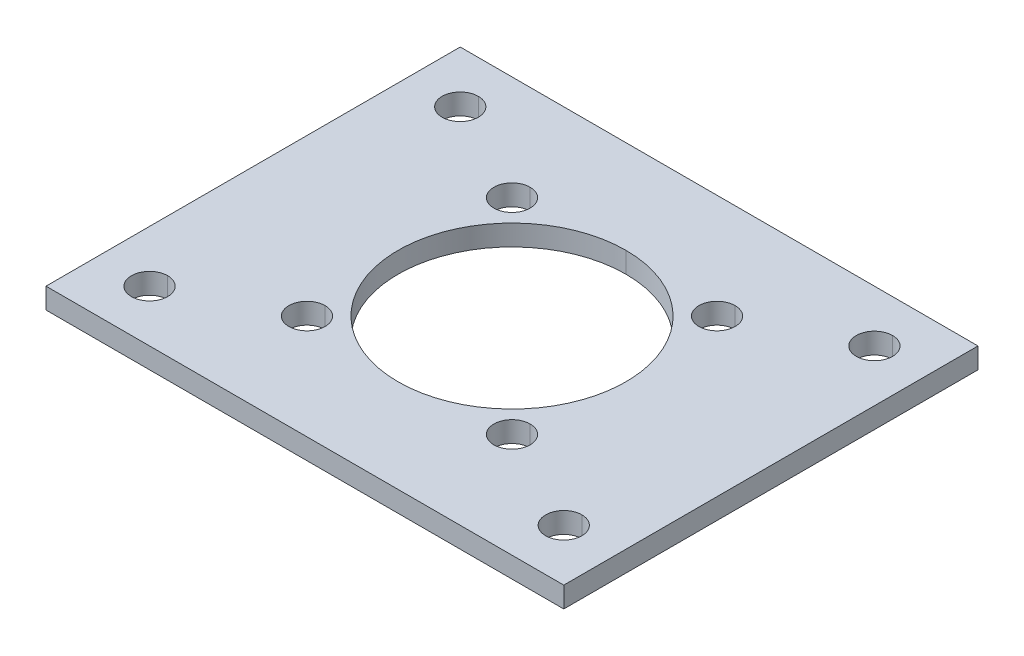
ISO-10303-21;
HEADER;
FILE_DESCRIPTION(('STEP AP214'),'2;1');
FILE_NAME('part.step','',(''),(''),'','','');
FILE_SCHEMA(('AUTOMOTIVE_DESIGN { 1 0 10303 214 1 1 1 1 }'));
ENDSEC;
DATA;
#1=APPLICATION_CONTEXT('core data for automotive mechanical design processes');
#2=APPLICATION_PROTOCOL_DEFINITION('international standard','automotive_design',2000,#1);
#3=PRODUCT_CONTEXT('',#1,'mechanical');
#4=PRODUCT('Part','Part','',(#3));
#5=PRODUCT_RELATED_PRODUCT_CATEGORY('part','',(#4));
#6=PRODUCT_DEFINITION_FORMATION('','',#4);
#7=PRODUCT_DEFINITION_CONTEXT('part definition',#1,'design');
#8=PRODUCT_DEFINITION('design','',#6,#7);
#9=PRODUCT_DEFINITION_SHAPE('','',#8);
#10=(LENGTH_UNIT() NAMED_UNIT(*) SI_UNIT(.MILLI.,.METRE.));
#11=(NAMED_UNIT(*) PLANE_ANGLE_UNIT() SI_UNIT($,.RADIAN.));
#12=(NAMED_UNIT(*) SI_UNIT($,.STERADIAN.) SOLID_ANGLE_UNIT());
#13=UNCERTAINTY_MEASURE_WITH_UNIT(LENGTH_MEASURE(1.E-05),#10,'distance_accuracy_value','');
#14=(GEOMETRIC_REPRESENTATION_CONTEXT(3) GLOBAL_UNCERTAINTY_ASSIGNED_CONTEXT((#13)) GLOBAL_UNIT_ASSIGNED_CONTEXT((#10,
#11,#12)) REPRESENTATION_CONTEXT('',''));
#15=CARTESIAN_POINT('',(0.,0.,0.));
#16=DIRECTION('',(0.,0.,1.));
#17=DIRECTION('',(1.,0.,0.));
#18=AXIS2_PLACEMENT_3D('',#15,#16,#17);
#19=CARTESIAN_POINT('',(-9.89949493661162,2.,-9.89949493661117));
#20=DIRECTION('',(0.,-1.,0.));
#21=DIRECTION('',(0.,0.,-1.));
#22=AXIS2_PLACEMENT_3D('',#19,#20,#21);
#23=CYLINDRICAL_SURFACE('',#22,1.7500000000006);
#24=DIRECTION('',(0.,-1.,0.));
#25=VECTOR('',#24,1.);
#26=CARTESIAN_POINT('',(-9.89949493661162,2.,-8.14949493661057));
#27=LINE('',#26,#25);
#28=CARTESIAN_POINT('',(-9.89949493661162,2.,-8.14949493661057));
#29=VERTEX_POINT('',#28);
#30=CARTESIAN_POINT('',(-9.89949493661162,0.,-8.14949493661057));
#31=VERTEX_POINT('',#30);
#32=EDGE_CURVE('E291',#29,#31,#27,.T.);
#33=ORIENTED_EDGE('',*,*,#32,.F.);
#34=CARTESIAN_POINT('',(-9.89949493661162,2.,-9.89949493661117));
#35=DIRECTION('',(0.,1.,0.));
#36=DIRECTION('',(0.,0.,1.));
#37=AXIS2_PLACEMENT_3D('',#34,#35,#36);
#38=CIRCLE('',#37,1.7500000000006);
#39=CARTESIAN_POINT('',(-9.89949493661162,2.,-11.6494949366118));
#40=VERTEX_POINT('',#39);
#41=EDGE_CURVE('E567',#29,#40,#38,.T.);
#42=ORIENTED_EDGE('',*,*,#41,.T.);
#43=DIRECTION('',(0.,-1.,0.));
#44=VECTOR('',#43,1.);
#45=CARTESIAN_POINT('',(-9.89949493661162,2.,-11.6494949366118));
#46=LINE('',#45,#44);
#47=CARTESIAN_POINT('',(-9.89949493661162,0.,-11.6494949366118));
#48=VERTEX_POINT('',#47);
#49=EDGE_CURVE('E456',#40,#48,#46,.T.);
#50=ORIENTED_EDGE('',*,*,#49,.T.);
#51=CARTESIAN_POINT('',(-9.89949493661162,0.,-9.89949493661117));
#52=DIRECTION('',(0.,1.,0.));
#53=DIRECTION('',(0.,0.,1.));
#54=AXIS2_PLACEMENT_3D('',#51,#52,#53);
#55=CIRCLE('',#54,1.7500000000006);
#56=EDGE_CURVE('E301',#31,#48,#55,.T.);
#57=ORIENTED_EDGE('',*,*,#56,.F.);
#58=EDGE_LOOP('',(#33,#42,#50,#57));
#59=FACE_BOUND('',#58,.T.);
#60=ADVANCED_FACE('F16',(#59),#23,.F.);
#61=CARTESIAN_POINT('',(-9.89949493661117,2.,9.89949493661216));
#62=DIRECTION('',(0.,-1.,0.));
#63=DIRECTION('',(0.,0.,-1.));
#64=AXIS2_PLACEMENT_3D('',#61,#62,#63);
#65=CYLINDRICAL_SURFACE('',#64,1.75000000000041);
#66=DIRECTION('',(0.,-1.,0.));
#67=VECTOR('',#66,1.);
#68=CARTESIAN_POINT('',(-9.89949493661117,2.,11.6494949366126));
#69=LINE('',#68,#67);
#70=CARTESIAN_POINT('',(-9.89949493661117,2.,11.6494949366126));
#71=VERTEX_POINT('',#70);
#72=CARTESIAN_POINT('',(-9.89949493661117,0.,11.6494949366126));
#73=VERTEX_POINT('',#72);
#74=EDGE_CURVE('E367',#71,#73,#69,.T.);
#75=ORIENTED_EDGE('',*,*,#74,.F.);
#76=CARTESIAN_POINT('',(-9.89949493661117,2.,9.89949493661216));
#77=DIRECTION('',(0.,1.,0.));
#78=DIRECTION('',(0.,0.,1.));
#79=AXIS2_PLACEMENT_3D('',#76,#77,#78);
#80=CIRCLE('',#79,1.75000000000041);
#81=CARTESIAN_POINT('',(-9.89949493661117,2.,8.14949493661176));
#82=VERTEX_POINT('',#81);
#83=EDGE_CURVE('E278',#71,#82,#80,.T.);
#84=ORIENTED_EDGE('',*,*,#83,.T.);
#85=DIRECTION('',(0.,-1.,0.));
#86=VECTOR('',#85,1.);
#87=CARTESIAN_POINT('',(-9.89949493661117,2.,8.14949493661176));
#88=LINE('',#87,#86);
#89=CARTESIAN_POINT('',(-9.89949493661117,0.,8.14949493661176));
#90=VERTEX_POINT('',#89);
#91=EDGE_CURVE('E379',#82,#90,#88,.T.);
#92=ORIENTED_EDGE('',*,*,#91,.T.);
#93=CARTESIAN_POINT('',(-9.89949493661117,0.,9.89949493661216));
#94=DIRECTION('',(0.,1.,0.));
#95=DIRECTION('',(0.,0.,1.));
#96=AXIS2_PLACEMENT_3D('',#93,#94,#95);
#97=CIRCLE('',#96,1.75000000000041);
#98=EDGE_CURVE('E499',#73,#90,#97,.T.);
#99=ORIENTED_EDGE('',*,*,#98,.F.);
#100=EDGE_LOOP('',(#75,#84,#92,#99));
#101=FACE_BOUND('',#100,.T.);
#102=ADVANCED_FACE('F589',(#101),#65,.F.);
#103=CARTESIAN_POINT('',(9.89949493661216,2.,9.89949493661172));
#104=DIRECTION('',(0.,-1.,0.));
#105=DIRECTION('',(0.,0.,-1.));
#106=AXIS2_PLACEMENT_3D('',#103,#104,#105);
#107=CYLINDRICAL_SURFACE('',#106,1.74999999999986);
#108=DIRECTION('',(0.,-1.,0.));
#109=VECTOR('',#108,1.);
#110=CARTESIAN_POINT('',(9.89949493661216,2.,11.6494949366116));
#111=LINE('',#110,#109);
#112=CARTESIAN_POINT('',(9.89949493661216,2.,11.6494949366116));
#113=VERTEX_POINT('',#112);
#114=CARTESIAN_POINT('',(9.89949493661216,0.,11.6494949366116));
#115=VERTEX_POINT('',#114);
#116=EDGE_CURVE('E404',#113,#115,#111,.T.);
#117=ORIENTED_EDGE('',*,*,#116,.F.);
#118=CARTESIAN_POINT('',(9.89949493661216,2.,9.89949493661172));
#119=DIRECTION('',(0.,1.,0.));
#120=DIRECTION('',(0.,0.,1.));
#121=AXIS2_PLACEMENT_3D('',#118,#119,#120);
#122=CIRCLE('',#121,1.74999999999986);
#123=CARTESIAN_POINT('',(9.89949493661216,2.,8.14949493661186));
#124=VERTEX_POINT('',#123);
#125=EDGE_CURVE('E275',#113,#124,#122,.T.);
#126=ORIENTED_EDGE('',*,*,#125,.T.);
#127=DIRECTION('',(0.,-1.,0.));
#128=VECTOR('',#127,1.);
#129=CARTESIAN_POINT('',(9.89949493661216,2.,8.14949493661186));
#130=LINE('',#129,#128);
#131=CARTESIAN_POINT('',(9.89949493661216,0.,8.14949493661186));
#132=VERTEX_POINT('',#131);
#133=EDGE_CURVE('E387',#124,#132,#130,.T.);
#134=ORIENTED_EDGE('',*,*,#133,.T.);
#135=CARTESIAN_POINT('',(9.89949493661216,0.,9.89949493661172));
#136=DIRECTION('',(0.,1.,0.));
#137=DIRECTION('',(0.,0.,1.));
#138=AXIS2_PLACEMENT_3D('',#135,#136,#137);
#139=CIRCLE('',#138,1.74999999999986);
#140=EDGE_CURVE('E252',#115,#132,#139,.T.);
#141=ORIENTED_EDGE('',*,*,#140,.F.);
#142=EDGE_LOOP('',(#117,#126,#134,#141));
#143=FACE_BOUND('',#142,.T.);
#144=ADVANCED_FACE('F1100',(#143),#107,.F.);
#145=CARTESIAN_POINT('',(-20.,2.,15.));
#146=DIRECTION('',(0.,-1.,0.));
#147=DIRECTION('',(0.,0.,-1.));
#148=AXIS2_PLACEMENT_3D('',#145,#146,#147);
#149=CYLINDRICAL_SURFACE('',#148,1.75);
#150=DIRECTION('',(0.,-1.,0.));
#151=VECTOR('',#150,1.);
#152=CARTESIAN_POINT('',(-20.,2.,16.75));
#153=LINE('',#152,#151);
#154=CARTESIAN_POINT('',(-20.,2.,16.75));
#155=VERTEX_POINT('',#154);
#156=CARTESIAN_POINT('',(-20.,0.,16.75));
#157=VERTEX_POINT('',#156);
#158=EDGE_CURVE('E320',#155,#157,#153,.T.);
#159=ORIENTED_EDGE('',*,*,#158,.F.);
#160=CARTESIAN_POINT('',(-20.,2.,15.));
#161=DIRECTION('',(0.,1.,0.));
#162=DIRECTION('',(0.,0.,1.));
#163=AXIS2_PLACEMENT_3D('',#160,#161,#162);
#164=CIRCLE('',#163,1.75);
#165=CARTESIAN_POINT('',(-20.,2.,13.25));
#166=VERTEX_POINT('',#165);
#167=EDGE_CURVE('E279',#155,#166,#164,.T.);
#168=ORIENTED_EDGE('',*,*,#167,.T.);
#169=DIRECTION('',(0.,-1.,0.));
#170=VECTOR('',#169,1.);
#171=CARTESIAN_POINT('',(-20.,2.,13.25));
#172=LINE('',#171,#170);
#173=CARTESIAN_POINT('',(-20.,0.,13.25));
#174=VERTEX_POINT('',#173);
#175=EDGE_CURVE('E436',#166,#174,#172,.T.);
#176=ORIENTED_EDGE('',*,*,#175,.T.);
#177=CARTESIAN_POINT('',(-20.,0.,15.));
#178=DIRECTION('',(0.,1.,0.));
#179=DIRECTION('',(0.,0.,1.));
#180=AXIS2_PLACEMENT_3D('',#177,#178,#179);
#181=CIRCLE('',#180,1.75);
#182=EDGE_CURVE('E20',#157,#174,#181,.T.);
#183=ORIENTED_EDGE('',*,*,#182,.F.);
#184=EDGE_LOOP('',(#159,#168,#176,#183));
#185=FACE_BOUND('',#184,.T.);
#186=ADVANCED_FACE('F1016',(#185),#149,.F.);
#187=CARTESIAN_POINT('',(-20.,2.,-15.));
#188=DIRECTION('',(0.,-1.,0.));
#189=DIRECTION('',(0.,0.,-1.));
#190=AXIS2_PLACEMENT_3D('',#187,#188,#189);
#191=CYLINDRICAL_SURFACE('',#190,1.75);
#192=DIRECTION('',(0.,-1.,0.));
#193=VECTOR('',#192,1.);
#194=CARTESIAN_POINT('',(-20.,2.,-13.25));
#195=LINE('',#194,#193);
#196=CARTESIAN_POINT('',(-20.,2.,-13.25));
#197=VERTEX_POINT('',#196);
#198=CARTESIAN_POINT('',(-20.,0.,-13.25));
#199=VERTEX_POINT('',#198);
#200=EDGE_CURVE('E312',#197,#199,#195,.T.);
#201=ORIENTED_EDGE('',*,*,#200,.F.);
#202=CARTESIAN_POINT('',(-20.,2.,-15.));
#203=DIRECTION('',(0.,1.,0.));
#204=DIRECTION('',(0.,0.,1.));
#205=AXIS2_PLACEMENT_3D('',#202,#203,#204);
#206=CIRCLE('',#205,1.75);
#207=CARTESIAN_POINT('',(-20.,2.,-16.75));
#208=VERTEX_POINT('',#207);
#209=EDGE_CURVE('E462',#197,#208,#206,.T.);
#210=ORIENTED_EDGE('',*,*,#209,.T.);
#211=DIRECTION('',(0.,-1.,0.));
#212=VECTOR('',#211,1.);
#213=CARTESIAN_POINT('',(-20.,2.,-16.75));
#214=LINE('',#213,#212);
#215=CARTESIAN_POINT('',(-20.,0.,-16.75));
#216=VERTEX_POINT('',#215);
#217=EDGE_CURVE('E515',#208,#216,#214,.T.);
#218=ORIENTED_EDGE('',*,*,#217,.T.);
#219=CARTESIAN_POINT('',(-20.,0.,-15.));
#220=DIRECTION('',(0.,1.,0.));
#221=DIRECTION('',(0.,0.,1.));
#222=AXIS2_PLACEMENT_3D('',#219,#220,#221);
#223=CIRCLE('',#222,1.75);
#224=EDGE_CURVE('E516',#199,#216,#223,.T.);
#225=ORIENTED_EDGE('',*,*,#224,.F.);
#226=EDGE_LOOP('',(#201,#210,#218,#225));
#227=FACE_BOUND('',#226,.T.);
#228=ADVANCED_FACE('F1012',(#227),#191,.F.);
#229=CARTESIAN_POINT('',(9.89949493661172,2.,-9.89949493661161));
#230=DIRECTION('',(0.,-1.,0.));
#231=DIRECTION('',(0.,0.,-1.));
#232=AXIS2_PLACEMENT_3D('',#229,#230,#231);
#233=CYLINDRICAL_SURFACE('',#232,1.75);
#234=DIRECTION('',(0.,-1.,0.));
#235=VECTOR('',#234,1.);
#236=CARTESIAN_POINT('',(9.89949493661172,2.,-8.14949493661162));
#237=LINE('',#236,#235);
#238=CARTESIAN_POINT('',(9.89949493661172,2.,-8.14949493661161));
#239=VERTEX_POINT('',#238);
#240=CARTESIAN_POINT('',(9.89949493661172,0.,-8.14949493661161));
#241=VERTEX_POINT('',#240);
#242=EDGE_CURVE('E497',#239,#241,#237,.T.);
#243=ORIENTED_EDGE('',*,*,#242,.F.);
#244=CARTESIAN_POINT('',(9.89949493661172,2.,-9.89949493661161));
#245=DIRECTION('',(0.,1.,0.));
#246=DIRECTION('',(0.,0.,1.));
#247=AXIS2_PLACEMENT_3D('',#244,#245,#246);
#248=CIRCLE('',#247,1.75);
#249=CARTESIAN_POINT('',(9.89949493661172,2.,-11.6494949366116));
#250=VERTEX_POINT('',#249);
#251=EDGE_CURVE('E459',#239,#250,#248,.T.);
#252=ORIENTED_EDGE('',*,*,#251,.T.);
#253=DIRECTION('',(0.,-1.,0.));
#254=VECTOR('',#253,1.);
#255=CARTESIAN_POINT('',(9.89949493661172,2.,-11.6494949366116));
#256=LINE('',#255,#254);
#257=CARTESIAN_POINT('',(9.89949493661172,0.,-11.6494949366116));
#258=VERTEX_POINT('',#257);
#259=EDGE_CURVE('E467',#250,#258,#256,.T.);
#260=ORIENTED_EDGE('',*,*,#259,.T.);
#261=CARTESIAN_POINT('',(9.89949493661172,0.,-9.89949493661161));
#262=DIRECTION('',(0.,1.,0.));
#263=DIRECTION('',(0.,0.,1.));
#264=AXIS2_PLACEMENT_3D('',#261,#262,#263);
#265=CIRCLE('',#264,1.75);
#266=EDGE_CURVE('E620',#241,#258,#265,.T.);
#267=ORIENTED_EDGE('',*,*,#266,.F.);
#268=EDGE_LOOP('',(#243,#252,#260,#267));
#269=FACE_BOUND('',#268,.T.);
#270=ADVANCED_FACE('F815',(#269),#233,.F.);
#271=CARTESIAN_POINT('',(20.,2.,15.));
#272=DIRECTION('',(0.,-1.,0.));
#273=DIRECTION('',(0.,0.,-1.));
#274=AXIS2_PLACEMENT_3D('',#271,#272,#273);
#275=CYLINDRICAL_SURFACE('',#274,1.75);
#276=DIRECTION('',(0.,-1.,0.));
#277=VECTOR('',#276,1.);
#278=CARTESIAN_POINT('',(20.,2.,16.75));
#279=LINE('',#278,#277);
#280=CARTESIAN_POINT('',(20.,2.,16.75));
#281=VERTEX_POINT('',#280);
#282=CARTESIAN_POINT('',(20.,0.,16.75));
#283=VERTEX_POINT('',#282);
#284=EDGE_CURVE('E345',#281,#283,#279,.T.);
#285=ORIENTED_EDGE('',*,*,#284,.F.);
#286=CARTESIAN_POINT('',(20.,2.,15.));
#287=DIRECTION('',(0.,1.,0.));
#288=DIRECTION('',(0.,0.,1.));
#289=AXIS2_PLACEMENT_3D('',#286,#287,#288);
#290=CIRCLE('',#289,1.75);
#291=CARTESIAN_POINT('',(20.,2.,13.25));
#292=VERTEX_POINT('',#291);
#293=EDGE_CURVE('E223',#281,#292,#290,.T.);
#294=ORIENTED_EDGE('',*,*,#293,.T.);
#295=DIRECTION('',(0.,-1.,0.));
#296=VECTOR('',#295,1.);
#297=CARTESIAN_POINT('',(20.,2.,13.25));
#298=LINE('',#297,#296);
#299=CARTESIAN_POINT('',(20.,0.,13.25));
#300=VERTEX_POINT('',#299);
#301=EDGE_CURVE('E237',#292,#300,#298,.T.);
#302=ORIENTED_EDGE('',*,*,#301,.T.);
#303=CARTESIAN_POINT('',(20.,0.,15.));
#304=DIRECTION('',(0.,1.,0.));
#305=DIRECTION('',(0.,0.,1.));
#306=AXIS2_PLACEMENT_3D('',#303,#304,#305);
#307=CIRCLE('',#306,1.75);
#308=EDGE_CURVE('E268',#283,#300,#307,.T.);
#309=ORIENTED_EDGE('',*,*,#308,.F.);
#310=EDGE_LOOP('',(#285,#294,#302,#309));
#311=FACE_BOUND('',#310,.T.);
#312=ADVANCED_FACE('F537',(#311),#275,.F.);
#313=CARTESIAN_POINT('',(20.,2.,-15.));
#314=DIRECTION('',(0.,-1.,0.));
#315=DIRECTION('',(0.,0.,-1.));
#316=AXIS2_PLACEMENT_3D('',#313,#314,#315);
#317=CYLINDRICAL_SURFACE('',#316,1.75);
#318=DIRECTION('',(0.,-1.,0.));
#319=VECTOR('',#318,1.);
#320=CARTESIAN_POINT('',(20.,2.,-13.25));
#321=LINE('',#320,#319);
#322=CARTESIAN_POINT('',(20.,2.,-13.25));
#323=VERTEX_POINT('',#322);
#324=CARTESIAN_POINT('',(20.,0.,-13.25));
#325=VERTEX_POINT('',#324);
#326=EDGE_CURVE('E218',#323,#325,#321,.T.);
#327=ORIENTED_EDGE('',*,*,#326,.F.);
#328=CARTESIAN_POINT('',(20.,2.,-15.));
#329=DIRECTION('',(0.,1.,0.));
#330=DIRECTION('',(0.,0.,1.));
#331=AXIS2_PLACEMENT_3D('',#328,#329,#330);
#332=CIRCLE('',#331,1.75);
#333=CARTESIAN_POINT('',(20.,2.,-16.75));
#334=VERTEX_POINT('',#333);
#335=EDGE_CURVE('E212',#323,#334,#332,.T.);
#336=ORIENTED_EDGE('',*,*,#335,.T.);
#337=DIRECTION('',(0.,-1.,0.));
#338=VECTOR('',#337,1.);
#339=CARTESIAN_POINT('',(20.,2.,-16.75));
#340=LINE('',#339,#338);
#341=CARTESIAN_POINT('',(20.,0.,-16.75));
#342=VERTEX_POINT('',#341);
#343=EDGE_CURVE('E215',#334,#342,#340,.T.);
#344=ORIENTED_EDGE('',*,*,#343,.T.);
#345=CARTESIAN_POINT('',(20.,0.,-15.));
#346=DIRECTION('',(0.,1.,0.));
#347=DIRECTION('',(0.,0.,1.));
#348=AXIS2_PLACEMENT_3D('',#345,#346,#347);
#349=CIRCLE('',#348,1.75);
#350=EDGE_CURVE('E344',#325,#342,#349,.T.);
#351=ORIENTED_EDGE('',*,*,#350,.F.);
#352=EDGE_LOOP('',(#327,#336,#344,#351));
#353=FACE_BOUND('',#352,.T.);
#354=ADVANCED_FACE('F214',(#353),#317,.F.);
#355=CARTESIAN_POINT('',(0.,2.,0.));
#356=DIRECTION('',(0.,-1.,0.));
#357=DIRECTION('',(0.,0.,-1.));
#358=AXIS2_PLACEMENT_3D('',#355,#356,#357);
#359=CYLINDRICAL_SURFACE('',#358,11.);
#360=DIRECTION('',(0.,-1.,0.));
#361=VECTOR('',#360,1.);
#362=CARTESIAN_POINT('',(0.,2.,11.));
#363=LINE('',#362,#361);
#364=CARTESIAN_POINT('',(0.,2.,11.));
#365=VERTEX_POINT('',#364);
#366=CARTESIAN_POINT('',(0.,0.,11.));
#367=VERTEX_POINT('',#366);
#368=EDGE_CURVE('E438',#365,#367,#363,.T.);
#369=ORIENTED_EDGE('',*,*,#368,.F.);
#370=CARTESIAN_POINT('',(0.,2.,0.));
#371=DIRECTION('',(0.,1.,0.));
#372=DIRECTION('',(0.,0.,1.));
#373=AXIS2_PLACEMENT_3D('',#370,#371,#372);
#374=CIRCLE('',#373,11.);
#375=CARTESIAN_POINT('',(0.,2.,-11.));
#376=VERTEX_POINT('',#375);
#377=EDGE_CURVE('E224',#365,#376,#374,.T.);
#378=ORIENTED_EDGE('',*,*,#377,.T.);
#379=DIRECTION('',(0.,-1.,0.));
#380=VECTOR('',#379,1.);
#381=CARTESIAN_POINT('',(0.,2.,-11.));
#382=LINE('',#381,#380);
#383=CARTESIAN_POINT('',(0.,0.,-11.));
#384=VERTEX_POINT('',#383);
#385=EDGE_CURVE('E323',#376,#384,#382,.T.);
#386=ORIENTED_EDGE('',*,*,#385,.T.);
#387=CARTESIAN_POINT('',(0.,0.,0.));
#388=DIRECTION('',(0.,1.,0.));
#389=DIRECTION('',(0.,0.,1.));
#390=AXIS2_PLACEMENT_3D('',#387,#388,#389);
#391=CIRCLE('',#390,11.);
#392=EDGE_CURVE('E339',#367,#384,#391,.T.);
#393=ORIENTED_EDGE('',*,*,#392,.F.);
#394=EDGE_LOOP('',(#369,#378,#386,#393));
#395=FACE_BOUND('',#394,.T.);
#396=ADVANCED_FACE('F831',(#395),#359,.F.);
#397=CARTESIAN_POINT('',(25.,2.,-20.));
#398=DIRECTION('',(0.,0.,1.));
#399=DIRECTION('',(1.,0.,0.));
#400=AXIS2_PLACEMENT_3D('',#397,#398,#399);
#401=PLANE('',#400);
#402=DIRECTION('',(-1.,0.,0.));
#403=VECTOR('',#402,1.);
#404=CARTESIAN_POINT('',(25.,0.,-20.));
#405=LINE('',#404,#403);
#406=CARTESIAN_POINT('',(25.,0.,-20.));
#407=VERTEX_POINT('',#406);
#408=CARTESIAN_POINT('',(-25.,0.,-20.));
#409=VERTEX_POINT('',#408);
#410=EDGE_CURVE('E374',#407,#409,#405,.T.);
#411=ORIENTED_EDGE('',*,*,#410,.T.);
#412=DIRECTION('',(0.,-1.,0.));
#413=VECTOR('',#412,1.);
#414=CARTESIAN_POINT('',(-25.,2.,-20.));
#415=LINE('',#414,#413);
#416=CARTESIAN_POINT('',(-25.,2.,-20.));
#417=VERTEX_POINT('',#416);
#418=EDGE_CURVE('E271',#417,#409,#415,.T.);
#419=ORIENTED_EDGE('',*,*,#418,.F.);
#420=DIRECTION('',(-1.,0.,0.));
#421=VECTOR('',#420,1.);
#422=CARTESIAN_POINT('',(25.,2.,-20.));
#423=LINE('',#422,#421);
#424=CARTESIAN_POINT('',(25.,2.,-20.));
#425=VERTEX_POINT('',#424);
#426=EDGE_CURVE('E481',#425,#417,#423,.T.);
#427=ORIENTED_EDGE('',*,*,#426,.F.);
#428=DIRECTION('',(0.,-1.,0.));
#429=VECTOR('',#428,1.);
#430=CARTESIAN_POINT('',(25.,2.,-20.));
#431=LINE('',#430,#429);
#432=EDGE_CURVE('E10',#425,#407,#431,.T.);
#433=ORIENTED_EDGE('',*,*,#432,.T.);
#434=EDGE_LOOP('',(#411,#419,#427,#433));
#435=FACE_BOUND('',#434,.T.);
#436=ADVANCED_FACE('F838',(#435),#401,.F.);
#437=CARTESIAN_POINT('',(25.,2.,-20.));
#438=DIRECTION('',(-1.,0.,0.));
#439=DIRECTION('',(0.,1.,0.));
#440=AXIS2_PLACEMENT_3D('',#437,#438,#439);
#441=PLANE('',#440);
#442=DIRECTION('',(0.,0.,-1.));
#443=VECTOR('',#442,1.);
#444=CARTESIAN_POINT('',(25.,0.,-20.));
#445=LINE('',#444,#443);
#446=CARTESIAN_POINT('',(25.,0.,20.));
#447=VERTEX_POINT('',#446);
#448=EDGE_CURVE('E572',#447,#407,#445,.T.);
#449=ORIENTED_EDGE('',*,*,#448,.T.);
#450=ORIENTED_EDGE('',*,*,#432,.F.);
#451=DIRECTION('',(0.,0.,-1.));
#452=VECTOR('',#451,1.);
#453=CARTESIAN_POINT('',(25.,2.,-20.));
#454=LINE('',#453,#452);
#455=CARTESIAN_POINT('',(25.,2.,20.));
#456=VERTEX_POINT('',#455);
#457=EDGE_CURVE('E365',#456,#425,#454,.T.);
#458=ORIENTED_EDGE('',*,*,#457,.F.);
#459=DIRECTION('',(0.,-1.,0.));
#460=VECTOR('',#459,1.);
#461=CARTESIAN_POINT('',(25.,2.,20.));
#462=LINE('',#461,#460);
#463=EDGE_CURVE('E28',#456,#447,#462,.T.);
#464=ORIENTED_EDGE('',*,*,#463,.T.);
#465=EDGE_LOOP('',(#449,#450,#458,#464));
#466=FACE_BOUND('',#465,.T.);
#467=ADVANCED_FACE('F847',(#466),#441,.F.);
#468=CARTESIAN_POINT('',(25.,2.,20.));
#469=DIRECTION('',(0.,0.,-1.));
#470=DIRECTION('',(-1.,0.,0.));
#471=AXIS2_PLACEMENT_3D('',#468,#469,#470);
#472=PLANE('',#471);
#473=DIRECTION('',(1.,0.,0.));
#474=VECTOR('',#473,1.);
#475=CARTESIAN_POINT('',(25.,0.,20.));
#476=LINE('',#475,#474);
#477=CARTESIAN_POINT('',(-25.,0.,20.));
#478=VERTEX_POINT('',#477);
#479=EDGE_CURVE('E353',#478,#447,#476,.T.);
#480=ORIENTED_EDGE('',*,*,#479,.T.);
#481=ORIENTED_EDGE('',*,*,#463,.F.);
#482=DIRECTION('',(1.,0.,0.));
#483=VECTOR('',#482,1.);
#484=CARTESIAN_POINT('',(25.,2.,20.));
#485=LINE('',#484,#483);
#486=CARTESIAN_POINT('',(-25.,2.,20.));
#487=VERTEX_POINT('',#486);
#488=EDGE_CURVE('E352',#487,#456,#485,.T.);
#489=ORIENTED_EDGE('',*,*,#488,.F.);
#490=DIRECTION('',(0.,-1.,0.));
#491=VECTOR('',#490,1.);
#492=CARTESIAN_POINT('',(-25.,2.,20.));
#493=LINE('',#492,#491);
#494=EDGE_CURVE('E274',#487,#478,#493,.T.);
#495=ORIENTED_EDGE('',*,*,#494,.T.);
#496=EDGE_LOOP('',(#480,#481,#489,#495));
#497=FACE_BOUND('',#496,.T.);
#498=ADVANCED_FACE('F634',(#497),#472,.F.);
#499=CARTESIAN_POINT('',(-25.,2.,-20.));
#500=DIRECTION('',(1.,0.,0.));
#501=DIRECTION('',(0.,0.,-1.));
#502=AXIS2_PLACEMENT_3D('',#499,#500,#501);
#503=PLANE('',#502);
#504=DIRECTION('',(0.,0.,1.));
#505=VECTOR('',#504,1.);
#506=CARTESIAN_POINT('',(-25.,0.,-20.));
#507=LINE('',#506,#505);
#508=EDGE_CURVE('E299',#409,#478,#507,.T.);
#509=ORIENTED_EDGE('',*,*,#508,.T.);
#510=ORIENTED_EDGE('',*,*,#494,.F.);
#511=DIRECTION('',(0.,0.,1.));
#512=VECTOR('',#511,1.);
#513=CARTESIAN_POINT('',(-25.,2.,-20.));
#514=LINE('',#513,#512);
#515=EDGE_CURVE('E328',#417,#487,#514,.T.);
#516=ORIENTED_EDGE('',*,*,#515,.F.);
#517=ORIENTED_EDGE('',*,*,#418,.T.);
#518=EDGE_LOOP('',(#509,#510,#516,#517));
#519=FACE_BOUND('',#518,.T.);
#520=ADVANCED_FACE('F543',(#519),#503,.F.);
#521=CARTESIAN_POINT('',(0.,0.,0.));
#522=DIRECTION('',(0.,-1.,0.));
#523=DIRECTION('',(0.,0.,-1.));
#524=AXIS2_PLACEMENT_3D('',#521,#522,#523);
#525=PLANE('',#524);
#526=CARTESIAN_POINT('',(-9.89949493661162,0.,-9.89949493661117));
#527=DIRECTION('',(0.,1.,0.));
#528=DIRECTION('',(0.,0.,1.));
#529=AXIS2_PLACEMENT_3D('',#526,#527,#528);
#530=CIRCLE('',#529,1.7500000000006);
#531=EDGE_CURVE('E297',#48,#31,#530,.T.);
#532=ORIENTED_EDGE('',*,*,#531,.T.);
#533=ORIENTED_EDGE('',*,*,#56,.T.);
#534=EDGE_LOOP('',(#532,#533));
#535=FACE_BOUND('',#534,.T.);
#536=CARTESIAN_POINT('',(9.89949493661216,0.,9.89949493661172));
#537=DIRECTION('',(0.,1.,0.));
#538=DIRECTION('',(0.,0.,1.));
#539=AXIS2_PLACEMENT_3D('',#536,#537,#538);
#540=CIRCLE('',#539,1.74999999999986);
#541=EDGE_CURVE('E392',#132,#115,#540,.T.);
#542=ORIENTED_EDGE('',*,*,#541,.T.);
#543=ORIENTED_EDGE('',*,*,#140,.T.);
#544=EDGE_LOOP('',(#542,#543));
#545=FACE_BOUND('',#544,.T.);
#546=CARTESIAN_POINT('',(-20.,0.,-15.));
#547=DIRECTION('',(0.,1.,0.));
#548=DIRECTION('',(0.,0.,1.));
#549=AXIS2_PLACEMENT_3D('',#546,#547,#548);
#550=CIRCLE('',#549,1.75);
#551=EDGE_CURVE('E318',#216,#199,#550,.T.);
#552=ORIENTED_EDGE('',*,*,#551,.T.);
#553=ORIENTED_EDGE('',*,*,#224,.T.);
#554=EDGE_LOOP('',(#552,#553));
#555=FACE_BOUND('',#554,.T.);
#556=CARTESIAN_POINT('',(20.,0.,15.));
#557=DIRECTION('',(0.,1.,0.));
#558=DIRECTION('',(0.,0.,1.));
#559=AXIS2_PLACEMENT_3D('',#556,#557,#558);
#560=CIRCLE('',#559,1.75);
#561=EDGE_CURVE('E247',#300,#283,#560,.T.);
#562=ORIENTED_EDGE('',*,*,#561,.T.);
#563=ORIENTED_EDGE('',*,*,#308,.T.);
#564=EDGE_LOOP('',(#562,#563));
#565=FACE_BOUND('',#564,.T.);
#566=CARTESIAN_POINT('',(0.,0.,0.));
#567=DIRECTION('',(0.,1.,0.));
#568=DIRECTION('',(0.,0.,1.));
#569=AXIS2_PLACEMENT_3D('',#566,#567,#568);
#570=CIRCLE('',#569,11.);
#571=EDGE_CURVE('E329',#384,#367,#570,.T.);
#572=ORIENTED_EDGE('',*,*,#571,.T.);
#573=ORIENTED_EDGE('',*,*,#392,.T.);
#574=EDGE_LOOP('',(#572,#573));
#575=FACE_BOUND('',#574,.T.);
#576=CARTESIAN_POINT('',(20.,0.,-15.));
#577=DIRECTION('',(0.,1.,0.));
#578=DIRECTION('',(0.,0.,1.));
#579=AXIS2_PLACEMENT_3D('',#576,#577,#578);
#580=CIRCLE('',#579,1.75);
#581=EDGE_CURVE('E230',#342,#325,#580,.T.);
#582=ORIENTED_EDGE('',*,*,#581,.T.);
#583=ORIENTED_EDGE('',*,*,#350,.T.);
#584=EDGE_LOOP('',(#582,#583));
#585=FACE_BOUND('',#584,.T.);
#586=CARTESIAN_POINT('',(9.89949493661172,0.,-9.89949493661161));
#587=DIRECTION('',(0.,1.,0.));
#588=DIRECTION('',(0.,0.,1.));
#589=AXIS2_PLACEMENT_3D('',#586,#587,#588);
#590=CIRCLE('',#589,1.75);
#591=EDGE_CURVE('E473',#258,#241,#590,.T.);
#592=ORIENTED_EDGE('',*,*,#591,.T.);
#593=ORIENTED_EDGE('',*,*,#266,.T.);
#594=EDGE_LOOP('',(#592,#593));
#595=FACE_BOUND('',#594,.T.);
#596=CARTESIAN_POINT('',(-20.,0.,15.));
#597=DIRECTION('',(0.,1.,0.));
#598=DIRECTION('',(0.,0.,1.));
#599=AXIS2_PLACEMENT_3D('',#596,#597,#598);
#600=CIRCLE('',#599,1.75);
#601=EDGE_CURVE('E477',#174,#157,#600,.T.);
#602=ORIENTED_EDGE('',*,*,#601,.T.);
#603=ORIENTED_EDGE('',*,*,#182,.T.);
#604=EDGE_LOOP('',(#602,#603));
#605=FACE_BOUND('',#604,.T.);
#606=CARTESIAN_POINT('',(-9.89949493661117,0.,9.89949493661216));
#607=DIRECTION('',(0.,1.,0.));
#608=DIRECTION('',(0.,0.,1.));
#609=AXIS2_PLACEMENT_3D('',#606,#607,#608);
#610=CIRCLE('',#609,1.75000000000041);
#611=EDGE_CURVE('E372',#90,#73,#610,.T.);
#612=ORIENTED_EDGE('',*,*,#611,.T.);
#613=ORIENTED_EDGE('',*,*,#98,.T.);
#614=EDGE_LOOP('',(#612,#613));
#615=FACE_BOUND('',#614,.T.);
#616=ORIENTED_EDGE('',*,*,#508,.F.);
#617=ORIENTED_EDGE('',*,*,#410,.F.);
#618=ORIENTED_EDGE('',*,*,#448,.F.);
#619=ORIENTED_EDGE('',*,*,#479,.F.);
#620=EDGE_LOOP('',(#616,#617,#618,#619));
#621=FACE_BOUND('',#620,.T.);
#622=ADVANCED_FACE('F540',(#535,#545,#555,#565,#575,#585,#595,#605,#615,#621),#525,.T.);
#623=CARTESIAN_POINT('',(0.,2.,0.));
#624=DIRECTION('',(0.,-1.,0.));
#625=DIRECTION('',(0.,0.,-1.));
#626=AXIS2_PLACEMENT_3D('',#623,#624,#625);
#627=PLANE('',#626);
#628=CARTESIAN_POINT('',(-9.89949493661162,2.,-9.89949493661117));
#629=DIRECTION('',(0.,1.,0.));
#630=DIRECTION('',(0.,0.,1.));
#631=AXIS2_PLACEMENT_3D('',#628,#629,#630);
#632=CIRCLE('',#631,1.7500000000006);
#633=EDGE_CURVE('E298',#40,#29,#632,.T.);
#634=ORIENTED_EDGE('',*,*,#633,.F.);
#635=ORIENTED_EDGE('',*,*,#41,.F.);
#636=EDGE_LOOP('',(#634,#635));
#637=FACE_BOUND('',#636,.T.);
#638=CARTESIAN_POINT('',(-9.89949493661117,2.,9.89949493661216));
#639=DIRECTION('',(0.,1.,0.));
#640=DIRECTION('',(0.,0.,1.));
#641=AXIS2_PLACEMENT_3D('',#638,#639,#640);
#642=CIRCLE('',#641,1.75000000000041);
#643=EDGE_CURVE('E373',#82,#71,#642,.T.);
#644=ORIENTED_EDGE('',*,*,#643,.F.);
#645=ORIENTED_EDGE('',*,*,#83,.F.);
#646=EDGE_LOOP('',(#644,#645));
#647=FACE_BOUND('',#646,.T.);
#648=CARTESIAN_POINT('',(9.89949493661216,2.,9.89949493661172));
#649=DIRECTION('',(0.,1.,0.));
#650=DIRECTION('',(0.,0.,1.));
#651=AXIS2_PLACEMENT_3D('',#648,#649,#650);
#652=CIRCLE('',#651,1.74999999999986);
#653=EDGE_CURVE('E255',#124,#113,#652,.T.);
#654=ORIENTED_EDGE('',*,*,#653,.F.);
#655=ORIENTED_EDGE('',*,*,#125,.F.);
#656=EDGE_LOOP('',(#654,#655));
#657=FACE_BOUND('',#656,.T.);
#658=CARTESIAN_POINT('',(-20.,2.,15.));
#659=DIRECTION('',(0.,1.,0.));
#660=DIRECTION('',(0.,0.,1.));
#661=AXIS2_PLACEMENT_3D('',#658,#659,#660);
#662=CIRCLE('',#661,1.75);
#663=EDGE_CURVE('E391',#166,#155,#662,.T.);
#664=ORIENTED_EDGE('',*,*,#663,.F.);
#665=ORIENTED_EDGE('',*,*,#167,.F.);
#666=EDGE_LOOP('',(#664,#665));
#667=FACE_BOUND('',#666,.T.);
#668=CARTESIAN_POINT('',(-20.,2.,-15.));
#669=DIRECTION('',(0.,1.,0.));
#670=DIRECTION('',(0.,0.,1.));
#671=AXIS2_PLACEMENT_3D('',#668,#669,#670);
#672=CIRCLE('',#671,1.75);
#673=EDGE_CURVE('E319',#208,#197,#672,.T.);
#674=ORIENTED_EDGE('',*,*,#673,.F.);
#675=ORIENTED_EDGE('',*,*,#209,.F.);
#676=EDGE_LOOP('',(#674,#675));
#677=FACE_BOUND('',#676,.T.);
#678=CARTESIAN_POINT('',(9.89949493661172,2.,-9.89949493661161));
#679=DIRECTION('',(0.,1.,0.));
#680=DIRECTION('',(0.,0.,1.));
#681=AXIS2_PLACEMENT_3D('',#678,#679,#680);
#682=CIRCLE('',#681,1.75);
#683=EDGE_CURVE('E510',#250,#239,#682,.T.);
#684=ORIENTED_EDGE('',*,*,#683,.F.);
#685=ORIENTED_EDGE('',*,*,#251,.F.);
#686=EDGE_LOOP('',(#684,#685));
#687=FACE_BOUND('',#686,.T.);
#688=CARTESIAN_POINT('',(20.,2.,15.));
#689=DIRECTION('',(0.,1.,0.));
#690=DIRECTION('',(0.,0.,1.));
#691=AXIS2_PLACEMENT_3D('',#688,#689,#690);
#692=CIRCLE('',#691,1.75);
#693=EDGE_CURVE('E472',#292,#281,#692,.T.);
#694=ORIENTED_EDGE('',*,*,#693,.F.);
#695=ORIENTED_EDGE('',*,*,#293,.F.);
#696=EDGE_LOOP('',(#694,#695));
#697=FACE_BOUND('',#696,.T.);
#698=CARTESIAN_POINT('',(20.,2.,-15.));
#699=DIRECTION('',(0.,1.,0.));
#700=DIRECTION('',(0.,0.,1.));
#701=AXIS2_PLACEMENT_3D('',#698,#699,#700);
#702=CIRCLE('',#701,1.75);
#703=EDGE_CURVE('E228',#334,#323,#702,.T.);
#704=ORIENTED_EDGE('',*,*,#703,.F.);
#705=ORIENTED_EDGE('',*,*,#335,.F.);
#706=EDGE_LOOP('',(#704,#705));
#707=FACE_BOUND('',#706,.T.);
#708=CARTESIAN_POINT('',(0.,2.,0.));
#709=DIRECTION('',(0.,1.,0.));
#710=DIRECTION('',(0.,0.,1.));
#711=AXIS2_PLACEMENT_3D('',#708,#709,#710);
#712=CIRCLE('',#711,11.);
#713=EDGE_CURVE('E232',#376,#365,#712,.T.);
#714=ORIENTED_EDGE('',*,*,#713,.F.);
#715=ORIENTED_EDGE('',*,*,#377,.F.);
#716=EDGE_LOOP('',(#714,#715));
#717=FACE_BOUND('',#716,.T.);
#718=ORIENTED_EDGE('',*,*,#515,.T.);
#719=ORIENTED_EDGE('',*,*,#488,.T.);
#720=ORIENTED_EDGE('',*,*,#457,.T.);
#721=ORIENTED_EDGE('',*,*,#426,.T.);
#722=EDGE_LOOP('',(#718,#719,#720,#721));
#723=FACE_BOUND('',#722,.T.);
#724=ADVANCED_FACE('F234',(#637,#647,#657,#667,#677,#687,#697,#707,#717,#723),#627,.F.);
#725=CARTESIAN_POINT('',(0.,2.,0.));
#726=DIRECTION('',(0.,-1.,0.));
#727=DIRECTION('',(0.,0.,-1.));
#728=AXIS2_PLACEMENT_3D('',#725,#726,#727);
#729=CYLINDRICAL_SURFACE('',#728,11.);
#730=ORIENTED_EDGE('',*,*,#713,.T.);
#731=ORIENTED_EDGE('',*,*,#368,.T.);
#732=ORIENTED_EDGE('',*,*,#571,.F.);
#733=ORIENTED_EDGE('',*,*,#385,.F.);
#734=EDGE_LOOP('',(#730,#731,#732,#733));
#735=FACE_BOUND('',#734,.T.);
#736=ADVANCED_FACE('F596',(#735),#729,.F.);
#737=CARTESIAN_POINT('',(20.,2.,-15.));
#738=DIRECTION('',(0.,-1.,0.));
#739=DIRECTION('',(0.,0.,-1.));
#740=AXIS2_PLACEMENT_3D('',#737,#738,#739);
#741=CYLINDRICAL_SURFACE('',#740,1.75);
#742=ORIENTED_EDGE('',*,*,#703,.T.);
#743=ORIENTED_EDGE('',*,*,#326,.T.);
#744=ORIENTED_EDGE('',*,*,#581,.F.);
#745=ORIENTED_EDGE('',*,*,#343,.F.);
#746=EDGE_LOOP('',(#742,#743,#744,#745));
#747=FACE_BOUND('',#746,.T.);
#748=ADVANCED_FACE('F227',(#747),#741,.F.);
#749=CARTESIAN_POINT('',(20.,2.,15.));
#750=DIRECTION('',(0.,-1.,0.));
#751=DIRECTION('',(0.,0.,-1.));
#752=AXIS2_PLACEMENT_3D('',#749,#750,#751);
#753=CYLINDRICAL_SURFACE('',#752,1.75);
#754=ORIENTED_EDGE('',*,*,#693,.T.);
#755=ORIENTED_EDGE('',*,*,#284,.T.);
#756=ORIENTED_EDGE('',*,*,#561,.F.);
#757=ORIENTED_EDGE('',*,*,#301,.F.);
#758=EDGE_LOOP('',(#754,#755,#756,#757));
#759=FACE_BOUND('',#758,.T.);
#760=ADVANCED_FACE('F535',(#759),#753,.F.);
#761=CARTESIAN_POINT('',(9.89949493661172,2.,-9.89949493661161));
#762=DIRECTION('',(0.,-1.,0.));
#763=DIRECTION('',(0.,0.,-1.));
#764=AXIS2_PLACEMENT_3D('',#761,#762,#763);
#765=CYLINDRICAL_SURFACE('',#764,1.75);
#766=ORIENTED_EDGE('',*,*,#683,.T.);
#767=ORIENTED_EDGE('',*,*,#242,.T.);
#768=ORIENTED_EDGE('',*,*,#591,.F.);
#769=ORIENTED_EDGE('',*,*,#259,.F.);
#770=EDGE_LOOP('',(#766,#767,#768,#769));
#771=FACE_BOUND('',#770,.T.);
#772=ADVANCED_FACE('F803',(#771),#765,.F.);
#773=CARTESIAN_POINT('',(-20.,2.,-15.));
#774=DIRECTION('',(0.,-1.,0.));
#775=DIRECTION('',(0.,0.,-1.));
#776=AXIS2_PLACEMENT_3D('',#773,#774,#775);
#777=CYLINDRICAL_SURFACE('',#776,1.75);
#778=ORIENTED_EDGE('',*,*,#673,.T.);
#779=ORIENTED_EDGE('',*,*,#200,.T.);
#780=ORIENTED_EDGE('',*,*,#551,.F.);
#781=ORIENTED_EDGE('',*,*,#217,.F.);
#782=EDGE_LOOP('',(#778,#779,#780,#781));
#783=FACE_BOUND('',#782,.T.);
#784=ADVANCED_FACE('F18',(#783),#777,.F.);
#785=CARTESIAN_POINT('',(-20.,2.,15.));
#786=DIRECTION('',(0.,-1.,0.));
#787=DIRECTION('',(0.,0.,-1.));
#788=AXIS2_PLACEMENT_3D('',#785,#786,#787);
#789=CYLINDRICAL_SURFACE('',#788,1.75);
#790=ORIENTED_EDGE('',*,*,#663,.T.);
#791=ORIENTED_EDGE('',*,*,#158,.T.);
#792=ORIENTED_EDGE('',*,*,#601,.F.);
#793=ORIENTED_EDGE('',*,*,#175,.F.);
#794=EDGE_LOOP('',(#790,#791,#792,#793));
#795=FACE_BOUND('',#794,.T.);
#796=ADVANCED_FACE('F940',(#795),#789,.F.);
#797=CARTESIAN_POINT('',(9.89949493661216,2.,9.89949493661172));
#798=DIRECTION('',(0.,-1.,0.));
#799=DIRECTION('',(0.,0.,-1.));
#800=AXIS2_PLACEMENT_3D('',#797,#798,#799);
#801=CYLINDRICAL_SURFACE('',#800,1.74999999999986);
#802=ORIENTED_EDGE('',*,*,#653,.T.);
#803=ORIENTED_EDGE('',*,*,#116,.T.);
#804=ORIENTED_EDGE('',*,*,#541,.F.);
#805=ORIENTED_EDGE('',*,*,#133,.F.);
#806=EDGE_LOOP('',(#802,#803,#804,#805));
#807=FACE_BOUND('',#806,.T.);
#808=ADVANCED_FACE('F953',(#807),#801,.F.);
#809=CARTESIAN_POINT('',(-9.89949493661117,2.,9.89949493661216));
#810=DIRECTION('',(0.,-1.,0.));
#811=DIRECTION('',(0.,0.,-1.));
#812=AXIS2_PLACEMENT_3D('',#809,#810,#811);
#813=CYLINDRICAL_SURFACE('',#812,1.75000000000041);
#814=ORIENTED_EDGE('',*,*,#643,.T.);
#815=ORIENTED_EDGE('',*,*,#74,.T.);
#816=ORIENTED_EDGE('',*,*,#611,.F.);
#817=ORIENTED_EDGE('',*,*,#91,.F.);
#818=EDGE_LOOP('',(#814,#815,#816,#817));
#819=FACE_BOUND('',#818,.T.);
#820=ADVANCED_FACE('F593',(#819),#813,.F.);
#821=CARTESIAN_POINT('',(-9.89949493661162,2.,-9.89949493661117));
#822=DIRECTION('',(0.,-1.,0.));
#823=DIRECTION('',(0.,0.,-1.));
#824=AXIS2_PLACEMENT_3D('',#821,#822,#823);
#825=CYLINDRICAL_SURFACE('',#824,1.7500000000006);
#826=ORIENTED_EDGE('',*,*,#633,.T.);
#827=ORIENTED_EDGE('',*,*,#32,.T.);
#828=ORIENTED_EDGE('',*,*,#531,.F.);
#829=ORIENTED_EDGE('',*,*,#49,.F.);
#830=EDGE_LOOP('',(#826,#827,#828,#829));
#831=FACE_BOUND('',#830,.T.);
#832=ADVANCED_FACE('F978',(#831),#825,.F.);
#833=CLOSED_SHELL('',(#60,#102,#144,#186,#228,#270,#312,#354,#396,#436,#467,#498,#520,#622,#724,
#736,#748,#760,#772,#784,#796,#808,#820,#832));
#834=MANIFOLD_SOLID_BREP('B1',#833);
#835=ADVANCED_BREP_SHAPE_REPRESENTATION('',(#18,#834),#14);
#836=SHAPE_DEFINITION_REPRESENTATION(#9,#835);
ENDSEC;
END-ISO-10303-21;
